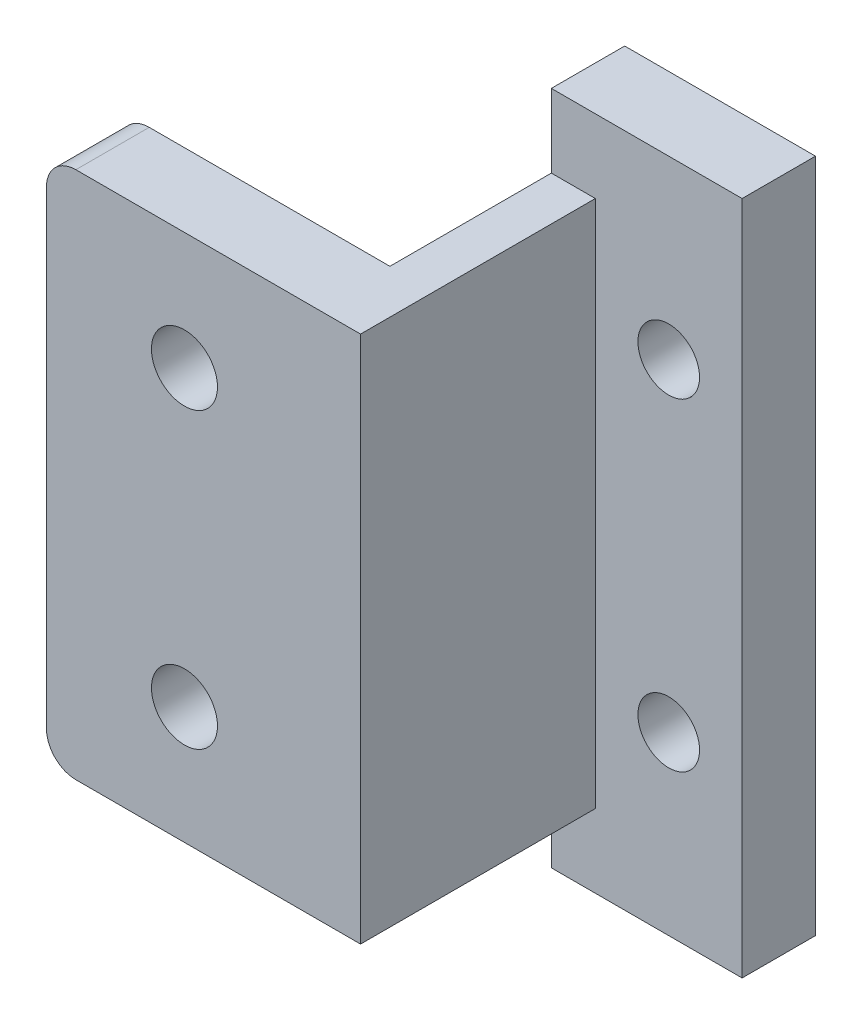
ISO-10303-21;
HEADER;
FILE_DESCRIPTION(('STEP AP214'),'2;1');
FILE_NAME('part.step','',(''),(''),'','','');
FILE_SCHEMA(('AUTOMOTIVE_DESIGN { 1 0 10303 214 1 1 1 1 }'));
ENDSEC;
DATA;
#1=APPLICATION_CONTEXT('core data for automotive mechanical design processes');
#2=APPLICATION_PROTOCOL_DEFINITION('international standard','automotive_design',2000,#1);
#3=PRODUCT_CONTEXT('',#1,'mechanical');
#4=PRODUCT('Part','Part','',(#3));
#5=PRODUCT_RELATED_PRODUCT_CATEGORY('part','',(#4));
#6=PRODUCT_DEFINITION_FORMATION('','',#4);
#7=PRODUCT_DEFINITION_CONTEXT('part definition',#1,'design');
#8=PRODUCT_DEFINITION('design','',#6,#7);
#9=PRODUCT_DEFINITION_SHAPE('','',#8);
#10=(LENGTH_UNIT() NAMED_UNIT(*) SI_UNIT(.MILLI.,.METRE.));
#11=(NAMED_UNIT(*) PLANE_ANGLE_UNIT() SI_UNIT($,.RADIAN.));
#12=(NAMED_UNIT(*) SI_UNIT($,.STERADIAN.) SOLID_ANGLE_UNIT());
#13=UNCERTAINTY_MEASURE_WITH_UNIT(LENGTH_MEASURE(1.E-05),#10,'distance_accuracy_value','');
#14=(GEOMETRIC_REPRESENTATION_CONTEXT(3) GLOBAL_UNCERTAINTY_ASSIGNED_CONTEXT((#13)) GLOBAL_UNIT_ASSIGNED_CONTEXT((#10,
#11,#12)) REPRESENTATION_CONTEXT('',''));
#15=CARTESIAN_POINT('',(0.,0.,0.));
#16=DIRECTION('',(0.,0.,1.));
#17=DIRECTION('',(1.,0.,0.));
#18=AXIS2_PLACEMENT_3D('',#15,#16,#17);
#19=CARTESIAN_POINT('',(0.,0.,-11.));
#20=DIRECTION('',(0.,0.,-1.));
#21=DIRECTION('',(-1.,0.,0.));
#22=AXIS2_PLACEMENT_3D('',#19,#20,#21);
#23=PLANE('',#22);
#24=CARTESIAN_POINT('',(19.0000000000037,29.,-11.));
#25=DIRECTION('',(0.,0.,1.));
#26=DIRECTION('',(1.,0.,0.));
#27=AXIS2_PLACEMENT_3D('',#24,#25,#26);
#28=CIRCLE('',#27,2.1);
#29=CARTESIAN_POINT('',(21.1000000000037,29.,-11.));
#30=VERTEX_POINT('',#29);
#31=EDGE_CURVE('E283',#30,#30,#28,.T.);
#32=ORIENTED_EDGE('',*,*,#31,.F.);
#33=EDGE_LOOP('',(#32));
#34=FACE_BOUND('',#33,.T.);
#35=CARTESIAN_POINT('',(19.0000000000037,7.,-11.));
#36=DIRECTION('',(0.,0.,1.));
#37=DIRECTION('',(1.,0.,0.));
#38=AXIS2_PLACEMENT_3D('',#35,#36,#37);
#39=CIRCLE('',#38,2.1);
#40=CARTESIAN_POINT('',(21.1000000000037,7.,-11.));
#41=VERTEX_POINT('',#40);
#42=EDGE_CURVE('E164',#41,#41,#39,.T.);
#43=ORIENTED_EDGE('',*,*,#42,.F.);
#44=EDGE_LOOP('',(#43));
#45=FACE_BOUND('',#44,.T.);
#46=DIRECTION('',(-1.,0.,0.));
#47=VECTOR('',#46,1.);
#48=CARTESIAN_POINT('',(14.0000000000037,36.,-11.));
#49=LINE('',#48,#47);
#50=CARTESIAN_POINT('',(14.0000000000037,36.,-11.));
#51=VERTEX_POINT('',#50);
#52=CARTESIAN_POINT('',(11.0000000000037,36.,-11.));
#53=VERTEX_POINT('',#52);
#54=EDGE_CURVE('E154',#51,#53,#49,.T.);
#55=ORIENTED_EDGE('',*,*,#54,.F.);
#56=DIRECTION('',(0.,1.,0.));
#57=VECTOR('',#56,1.);
#58=CARTESIAN_POINT('',(14.0000000000037,0.,-11.));
#59=LINE('',#58,#57);
#60=CARTESIAN_POINT('',(14.0000000000037,0.,-11.));
#61=VERTEX_POINT('',#60);
#62=EDGE_CURVE('E181',#61,#51,#59,.T.);
#63=ORIENTED_EDGE('',*,*,#62,.F.);
#64=DIRECTION('',(-1.,0.,0.));
#65=VECTOR('',#64,1.);
#66=CARTESIAN_POINT('',(14.0000000000037,0.,-11.));
#67=LINE('',#66,#65);
#68=CARTESIAN_POINT('',(11.0000000000038,0.,-11.));
#69=VERTEX_POINT('',#68);
#70=EDGE_CURVE('E186',#61,#69,#67,.T.);
#71=ORIENTED_EDGE('',*,*,#70,.T.);
#72=DIRECTION('',(0.,-1.,0.));
#73=VECTOR('',#72,1.);
#74=CARTESIAN_POINT('',(11.0000000000037,41.,-11.));
#75=LINE('',#74,#73);
#76=CARTESIAN_POINT('',(11.0000000000037,-5.,-11.));
#77=VERTEX_POINT('',#76);
#78=EDGE_CURVE('E196',#69,#77,#75,.T.);
#79=ORIENTED_EDGE('',*,*,#78,.T.);
#80=DIRECTION('',(1.,0.,0.));
#81=VECTOR('',#80,1.);
#82=CARTESIAN_POINT('',(24.0000000000037,-5.,-11.));
#83=LINE('',#82,#81);
#84=CARTESIAN_POINT('',(24.0000000000037,-5.,-11.));
#85=VERTEX_POINT('',#84);
#86=EDGE_CURVE('E200',#77,#85,#83,.T.);
#87=ORIENTED_EDGE('',*,*,#86,.T.);
#88=DIRECTION('',(0.,1.,0.));
#89=VECTOR('',#88,1.);
#90=CARTESIAN_POINT('',(24.0000000000037,41.,-11.));
#91=LINE('',#90,#89);
#92=CARTESIAN_POINT('',(24.0000000000037,41.,-11.));
#93=VERTEX_POINT('',#92);
#94=EDGE_CURVE('E190',#85,#93,#91,.T.);
#95=ORIENTED_EDGE('',*,*,#94,.T.);
#96=DIRECTION('',(-1.,0.,0.));
#97=VECTOR('',#96,1.);
#98=CARTESIAN_POINT('',(24.0000000000037,41.,-11.));
#99=LINE('',#98,#97);
#100=CARTESIAN_POINT('',(11.0000000000037,41.,-11.));
#101=VERTEX_POINT('',#100);
#102=EDGE_CURVE('E193',#93,#101,#99,.T.);
#103=ORIENTED_EDGE('',*,*,#102,.T.);
#104=EDGE_CURVE('E197',#101,#53,#75,.T.);
#105=ORIENTED_EDGE('',*,*,#104,.T.);
#106=EDGE_LOOP('',(#55,#63,#71,#79,#87,#95,#103,#105));
#107=FACE_BOUND('',#106,.T.);
#108=ADVANCED_FACE('F36',(#34,#45,#107),#23,.F.);
#109=CARTESIAN_POINT('',(6.99999999999803,3.,5.));
#110=DIRECTION('',(0.,0.,1.));
#111=DIRECTION('',(1.,0.,0.));
#112=AXIS2_PLACEMENT_3D('',#109,#110,#111);
#113=PLANE('',#112);
#114=DIRECTION('',(0.,-1.,0.));
#115=VECTOR('',#114,1.);
#116=CARTESIAN_POINT('',(-7.40000000000161,36.,5.));
#117=LINE('',#116,#115);
#118=CARTESIAN_POINT('',(-7.40000000000161,34.,5.));
#119=VERTEX_POINT('',#118);
#120=CARTESIAN_POINT('',(-7.40000000000161,2.,5.));
#121=VERTEX_POINT('',#120);
#122=EDGE_CURVE('E252',#119,#121,#117,.T.);
#123=ORIENTED_EDGE('',*,*,#122,.T.);
#124=CARTESIAN_POINT('',(-5.40000000000161,2.,5.));
#125=DIRECTION('',(0.,0.,1.));
#126=DIRECTION('',(1.,0.,0.));
#127=AXIS2_PLACEMENT_3D('',#124,#125,#126);
#128=CIRCLE('',#127,2.);
#129=CARTESIAN_POINT('',(-5.40000000000161,0.,5.));
#130=VERTEX_POINT('',#129);
#131=EDGE_CURVE('E46',#121,#130,#128,.T.);
#132=ORIENTED_EDGE('',*,*,#131,.T.);
#133=DIRECTION('',(1.,0.,0.));
#134=VECTOR('',#133,1.);
#135=CARTESIAN_POINT('',(-7.40000000000161,0.,5.));
#136=LINE('',#135,#134);
#137=CARTESIAN_POINT('',(14.0000000000037,0.,5.));
#138=VERTEX_POINT('',#137);
#139=EDGE_CURVE('E256',#130,#138,#136,.T.);
#140=ORIENTED_EDGE('',*,*,#139,.T.);
#141=DIRECTION('',(0.,-1.,0.));
#142=VECTOR('',#141,1.);
#143=CARTESIAN_POINT('',(14.0000000000037,36.,5.));
#144=LINE('',#143,#142);
#145=CARTESIAN_POINT('',(14.0000000000037,36.,5.));
#146=VERTEX_POINT('',#145);
#147=EDGE_CURVE('E173',#146,#138,#144,.T.);
#148=ORIENTED_EDGE('',*,*,#147,.F.);
#149=DIRECTION('',(-1.,0.,0.));
#150=VECTOR('',#149,1.);
#151=CARTESIAN_POINT('',(6.99999999999803,36.,5.));
#152=LINE('',#151,#150);
#153=CARTESIAN_POINT('',(-5.40000000000161,36.,5.));
#154=VERTEX_POINT('',#153);
#155=EDGE_CURVE('E249',#146,#154,#152,.T.);
#156=ORIENTED_EDGE('',*,*,#155,.T.);
#157=CARTESIAN_POINT('',(-5.40000000000161,34.,5.));
#158=DIRECTION('',(0.,0.,1.));
#159=DIRECTION('',(1.,0.,0.));
#160=AXIS2_PLACEMENT_3D('',#157,#158,#159);
#161=CIRCLE('',#160,2.);
#162=EDGE_CURVE('E277',#154,#119,#161,.T.);
#163=ORIENTED_EDGE('',*,*,#162,.T.);
#164=EDGE_LOOP('',(#123,#132,#140,#148,#156,#163));
#165=FACE_BOUND('',#164,.T.);
#166=CARTESIAN_POINT('',(1.99999999999802,8.,5.));
#167=DIRECTION('',(0.,0.,1.));
#168=DIRECTION('',(1.,0.,0.));
#169=AXIS2_PLACEMENT_3D('',#166,#167,#168);
#170=CIRCLE('',#169,2.25);
#171=CARTESIAN_POINT('',(4.24999999999802,8.,5.));
#172=VERTEX_POINT('',#171);
#173=EDGE_CURVE('E139',#172,#172,#170,.T.);
#174=ORIENTED_EDGE('',*,*,#173,.F.);
#175=EDGE_LOOP('',(#174));
#176=FACE_BOUND('',#175,.T.);
#177=CARTESIAN_POINT('',(1.99999999999802,28.,5.));
#178=DIRECTION('',(0.,0.,1.));
#179=DIRECTION('',(1.,0.,0.));
#180=AXIS2_PLACEMENT_3D('',#177,#178,#179);
#181=CIRCLE('',#180,2.25000000000001);
#182=CARTESIAN_POINT('',(4.24999999999803,28.,5.));
#183=VERTEX_POINT('',#182);
#184=EDGE_CURVE('E235',#183,#183,#181,.T.);
#185=ORIENTED_EDGE('',*,*,#184,.F.);
#186=EDGE_LOOP('',(#185));
#187=FACE_BOUND('',#186,.T.);
#188=ADVANCED_FACE('F299',(#165,#176,#187),#113,.T.);
#189=CARTESIAN_POINT('',(6.99999999999803,3.,0.));
#190=DIRECTION('',(0.,0.,1.));
#191=DIRECTION('',(1.,0.,0.));
#192=AXIS2_PLACEMENT_3D('',#189,#190,#191);
#193=PLANE('',#192);
#194=DIRECTION('',(1.,0.,0.));
#195=VECTOR('',#194,1.);
#196=CARTESIAN_POINT('',(-7.40000000000161,0.,0.));
#197=LINE('',#196,#195);
#198=CARTESIAN_POINT('',(-5.40000000000161,0.,0.));
#199=VERTEX_POINT('',#198);
#200=CARTESIAN_POINT('',(11.0000000000038,0.,0.));
#201=VERTEX_POINT('',#200);
#202=EDGE_CURVE('E253',#199,#201,#197,.T.);
#203=ORIENTED_EDGE('',*,*,#202,.F.);
#204=CARTESIAN_POINT('',(-5.40000000000161,2.,0.));
#205=DIRECTION('',(0.,0.,1.));
#206=DIRECTION('',(1.,0.,0.));
#207=AXIS2_PLACEMENT_3D('',#204,#205,#206);
#208=CIRCLE('',#207,2.);
#209=CARTESIAN_POINT('',(-7.40000000000161,2.,0.));
#210=VERTEX_POINT('',#209);
#211=EDGE_CURVE('E269',#199,#210,#208,.F.);
#212=ORIENTED_EDGE('',*,*,#211,.T.);
#213=DIRECTION('',(0.,-1.,0.));
#214=VECTOR('',#213,1.);
#215=CARTESIAN_POINT('',(-7.40000000000161,36.,0.));
#216=LINE('',#215,#214);
#217=CARTESIAN_POINT('',(-7.40000000000161,34.,0.));
#218=VERTEX_POINT('',#217);
#219=EDGE_CURVE('E138',#218,#210,#216,.T.);
#220=ORIENTED_EDGE('',*,*,#219,.F.);
#221=CARTESIAN_POINT('',(-5.40000000000161,34.,0.));
#222=DIRECTION('',(0.,0.,1.));
#223=DIRECTION('',(1.,0.,0.));
#224=AXIS2_PLACEMENT_3D('',#221,#222,#223);
#225=CIRCLE('',#224,2.);
#226=CARTESIAN_POINT('',(-5.40000000000161,36.,0.));
#227=VERTEX_POINT('',#226);
#228=EDGE_CURVE('E135',#218,#227,#225,.F.);
#229=ORIENTED_EDGE('',*,*,#228,.T.);
#230=DIRECTION('',(-1.,0.,0.));
#231=VECTOR('',#230,1.);
#232=CARTESIAN_POINT('',(6.99999999999803,36.,0.));
#233=LINE('',#232,#231);
#234=CARTESIAN_POINT('',(11.0000000000038,36.,0.));
#235=VERTEX_POINT('',#234);
#236=EDGE_CURVE('E128',#235,#227,#233,.T.);
#237=ORIENTED_EDGE('',*,*,#236,.F.);
#238=DIRECTION('',(0.,1.,0.));
#239=VECTOR('',#238,1.);
#240=CARTESIAN_POINT('',(11.0000000000038,-7.00000000000001,0.));
#241=LINE('',#240,#239);
#242=EDGE_CURVE('E133',#201,#235,#241,.T.);
#243=ORIENTED_EDGE('',*,*,#242,.F.);
#244=EDGE_LOOP('',(#203,#212,#220,#229,#237,#243));
#245=FACE_BOUND('',#244,.T.);
#246=CARTESIAN_POINT('',(1.99999999999802,8.,0.));
#247=DIRECTION('',(0.,0.,1.));
#248=DIRECTION('',(1.,0.,0.));
#249=AXIS2_PLACEMENT_3D('',#246,#247,#248);
#250=CIRCLE('',#249,2.25);
#251=CARTESIAN_POINT('',(4.24999999999802,8.,0.));
#252=VERTEX_POINT('',#251);
#253=EDGE_CURVE('E239',#252,#252,#250,.T.);
#254=ORIENTED_EDGE('',*,*,#253,.T.);
#255=EDGE_LOOP('',(#254));
#256=FACE_BOUND('',#255,.T.);
#257=CARTESIAN_POINT('',(1.99999999999802,28.,0.));
#258=DIRECTION('',(0.,0.,1.));
#259=DIRECTION('',(1.,0.,0.));
#260=AXIS2_PLACEMENT_3D('',#257,#258,#259);
#261=CIRCLE('',#260,2.25000000000001);
#262=CARTESIAN_POINT('',(4.24999999999803,28.,0.));
#263=VERTEX_POINT('',#262);
#264=EDGE_CURVE('E225',#263,#263,#261,.T.);
#265=ORIENTED_EDGE('',*,*,#264,.T.);
#266=EDGE_LOOP('',(#265));
#267=FACE_BOUND('',#266,.T.);
#268=ADVANCED_FACE('F131',(#245,#256,#267),#193,.F.);
#269=CARTESIAN_POINT('',(6.99999999999803,36.,5.));
#270=DIRECTION('',(0.,-1.,0.));
#271=DIRECTION('',(0.,0.,-1.));
#272=AXIS2_PLACEMENT_3D('',#269,#270,#271);
#273=PLANE('',#272);
#274=ORIENTED_EDGE('',*,*,#236,.T.);
#275=DIRECTION('',(0.,0.,-1.));
#276=VECTOR('',#275,1.);
#277=CARTESIAN_POINT('',(-5.40000000000161,36.,5.));
#278=LINE('',#277,#276);
#279=EDGE_CURVE('E11',#227,#154,#278,.F.);
#280=ORIENTED_EDGE('',*,*,#279,.T.);
#281=ORIENTED_EDGE('',*,*,#155,.F.);
#282=DIRECTION('',(0.,0.,1.));
#283=VECTOR('',#282,1.);
#284=CARTESIAN_POINT('',(14.0000000000037,36.,-11.));
#285=LINE('',#284,#283);
#286=EDGE_CURVE('E169',#51,#146,#285,.T.);
#287=ORIENTED_EDGE('',*,*,#286,.F.);
#288=ORIENTED_EDGE('',*,*,#54,.T.);
#289=DIRECTION('',(0.,0.,-1.));
#290=VECTOR('',#289,1.);
#291=CARTESIAN_POINT('',(11.0000000000038,36.,-16.0000000000004));
#292=LINE('',#291,#290);
#293=EDGE_CURVE('E146',#235,#53,#292,.T.);
#294=ORIENTED_EDGE('',*,*,#293,.F.);
#295=EDGE_LOOP('',(#274,#280,#281,#287,#288,#294));
#296=FACE_BOUND('',#295,.T.);
#297=ADVANCED_FACE('F151',(#296),#273,.F.);
#298=CARTESIAN_POINT('',(-7.40000000000161,36.,5.));
#299=DIRECTION('',(1.,0.,0.));
#300=DIRECTION('',(0.,1.,0.));
#301=AXIS2_PLACEMENT_3D('',#298,#299,#300);
#302=PLANE('',#301);
#303=ORIENTED_EDGE('',*,*,#219,.T.);
#304=DIRECTION('',(0.,0.,-1.));
#305=VECTOR('',#304,1.);
#306=CARTESIAN_POINT('',(-7.40000000000161,2.,5.));
#307=LINE('',#306,#305);
#308=EDGE_CURVE('E60',#210,#121,#307,.F.);
#309=ORIENTED_EDGE('',*,*,#308,.T.);
#310=ORIENTED_EDGE('',*,*,#122,.F.);
#311=DIRECTION('',(0.,0.,-1.));
#312=VECTOR('',#311,1.);
#313=CARTESIAN_POINT('',(-7.40000000000161,34.,5.));
#314=LINE('',#313,#312);
#315=EDGE_CURVE('E272',#119,#218,#314,.T.);
#316=ORIENTED_EDGE('',*,*,#315,.T.);
#317=EDGE_LOOP('',(#303,#309,#310,#316));
#318=FACE_BOUND('',#317,.T.);
#319=ADVANCED_FACE('F349',(#318),#302,.F.);
#320=CARTESIAN_POINT('',(-7.40000000000161,0.,5.));
#321=DIRECTION('',(0.,1.,0.));
#322=DIRECTION('',(-1.,0.,0.));
#323=AXIS2_PLACEMENT_3D('',#320,#321,#322);
#324=PLANE('',#323);
#325=ORIENTED_EDGE('',*,*,#139,.F.);
#326=DIRECTION('',(0.,0.,-1.));
#327=VECTOR('',#326,1.);
#328=CARTESIAN_POINT('',(-5.40000000000161,0.,5.));
#329=LINE('',#328,#327);
#330=EDGE_CURVE('E258',#130,#199,#329,.T.);
#331=ORIENTED_EDGE('',*,*,#330,.T.);
#332=ORIENTED_EDGE('',*,*,#202,.T.);
#333=DIRECTION('',(0.,0.,-1.));
#334=VECTOR('',#333,1.);
#335=CARTESIAN_POINT('',(11.0000000000038,0.,5.));
#336=LINE('',#335,#334);
#337=EDGE_CURVE('E148',#201,#69,#336,.T.);
#338=ORIENTED_EDGE('',*,*,#337,.T.);
#339=ORIENTED_EDGE('',*,*,#70,.F.);
#340=DIRECTION('',(0.,0.,-1.));
#341=VECTOR('',#340,1.);
#342=CARTESIAN_POINT('',(14.0000000000037,0.,5.));
#343=LINE('',#342,#341);
#344=EDGE_CURVE('E177',#138,#61,#343,.T.);
#345=ORIENTED_EDGE('',*,*,#344,.F.);
#346=EDGE_LOOP('',(#325,#331,#332,#338,#339,#345));
#347=FACE_BOUND('',#346,.T.);
#348=ADVANCED_FACE('F340',(#347),#324,.F.);
#349=CARTESIAN_POINT('',(1.99999999999802,8.,5.));
#350=DIRECTION('',(0.,0.,-1.));
#351=DIRECTION('',(-1.,0.,0.));
#352=AXIS2_PLACEMENT_3D('',#349,#350,#351);
#353=CYLINDRICAL_SURFACE('',#352,2.25);
#354=ORIENTED_EDGE('',*,*,#173,.T.);
#355=EDGE_LOOP('',(#354));
#356=FACE_BOUND('',#355,.T.);
#357=ORIENTED_EDGE('',*,*,#253,.F.);
#358=EDGE_LOOP('',(#357));
#359=FACE_BOUND('',#358,.T.);
#360=ADVANCED_FACE('F336',(#356,#359),#353,.F.);
#361=CARTESIAN_POINT('',(1.99999999999802,28.,5.));
#362=DIRECTION('',(0.,0.,-1.));
#363=DIRECTION('',(-1.,0.,0.));
#364=AXIS2_PLACEMENT_3D('',#361,#362,#363);
#365=CYLINDRICAL_SURFACE('',#364,2.25000000000001);
#366=ORIENTED_EDGE('',*,*,#184,.T.);
#367=EDGE_LOOP('',(#366));
#368=FACE_BOUND('',#367,.T.);
#369=ORIENTED_EDGE('',*,*,#264,.F.);
#370=EDGE_LOOP('',(#369));
#371=FACE_BOUND('',#370,.T.);
#372=ADVANCED_FACE('F332',(#368,#371),#365,.F.);
#373=CARTESIAN_POINT('',(-11.9999999999965,136.100000000002,-16.0000000000004));
#374=DIRECTION('',(0.,0.,-1.));
#375=DIRECTION('',(0.,1.,0.));
#376=AXIS2_PLACEMENT_3D('',#373,#374,#375);
#377=PLANE('',#376);
#378=CARTESIAN_POINT('',(19.0000000000037,29.,-16.0000000000004));
#379=DIRECTION('',(0.,0.,-1.));
#380=DIRECTION('',(0.,1.,0.));
#381=AXIS2_PLACEMENT_3D('',#378,#379,#380);
#382=CIRCLE('',#381,2.1);
#383=CARTESIAN_POINT('',(19.0000000000037,31.1,-16.0000000000004));
#384=VERTEX_POINT('',#383);
#385=EDGE_CURVE('E40',#384,#384,#382,.T.);
#386=ORIENTED_EDGE('',*,*,#385,.F.);
#387=EDGE_LOOP('',(#386));
#388=FACE_BOUND('',#387,.T.);
#389=CARTESIAN_POINT('',(19.0000000000037,7.,-16.0000000000004));
#390=DIRECTION('',(0.,0.,-1.));
#391=DIRECTION('',(0.,1.,0.));
#392=AXIS2_PLACEMENT_3D('',#389,#390,#391);
#393=CIRCLE('',#392,2.1);
#394=CARTESIAN_POINT('',(19.0000000000037,9.1,-16.0000000000004));
#395=VERTEX_POINT('',#394);
#396=EDGE_CURVE('E162',#395,#395,#393,.T.);
#397=ORIENTED_EDGE('',*,*,#396,.F.);
#398=EDGE_LOOP('',(#397));
#399=FACE_BOUND('',#398,.T.);
#400=DIRECTION('',(0.,-1.,0.));
#401=VECTOR('',#400,1.);
#402=CARTESIAN_POINT('',(11.0000000000037,-5.00000000000001,-16.0000000000004));
#403=LINE('',#402,#401);
#404=CARTESIAN_POINT('',(11.0000000000037,41.,-16.0000000000004));
#405=VERTEX_POINT('',#404);
#406=CARTESIAN_POINT('',(11.0000000000037,-5.,-16.0000000000004));
#407=VERTEX_POINT('',#406);
#408=EDGE_CURVE('E202',#405,#407,#403,.T.);
#409=ORIENTED_EDGE('',*,*,#408,.F.);
#410=DIRECTION('',(-1.,0.,0.));
#411=VECTOR('',#410,1.);
#412=CARTESIAN_POINT('',(11.0000000000037,41.,-16.0000000000004));
#413=LINE('',#412,#411);
#414=CARTESIAN_POINT('',(24.0000000000037,41.,-16.0000000000004));
#415=VERTEX_POINT('',#414);
#416=EDGE_CURVE('E203',#415,#405,#413,.T.);
#417=ORIENTED_EDGE('',*,*,#416,.F.);
#418=DIRECTION('',(0.,1.,0.));
#419=VECTOR('',#418,1.);
#420=CARTESIAN_POINT('',(24.0000000000037,41.,-16.0000000000004));
#421=LINE('',#420,#419);
#422=CARTESIAN_POINT('',(24.0000000000037,-5.,-16.0000000000004));
#423=VERTEX_POINT('',#422);
#424=EDGE_CURVE('E209',#423,#415,#421,.T.);
#425=ORIENTED_EDGE('',*,*,#424,.F.);
#426=DIRECTION('',(1.,0.,0.));
#427=VECTOR('',#426,1.);
#428=CARTESIAN_POINT('',(24.0000000000037,-5.,-16.0000000000004));
#429=LINE('',#428,#427);
#430=EDGE_CURVE('E214',#407,#423,#429,.T.);
#431=ORIENTED_EDGE('',*,*,#430,.F.);
#432=EDGE_LOOP('',(#409,#417,#425,#431));
#433=FACE_BOUND('',#432,.T.);
#434=ADVANCED_FACE('F309',(#388,#399,#433),#377,.T.);
#435=CARTESIAN_POINT('',(11.0000000000037,-5.,-65.0407993409593));
#436=DIRECTION('',(-1.,0.,0.));
#437=DIRECTION('',(0.,-1.,0.));
#438=AXIS2_PLACEMENT_3D('',#435,#436,#437);
#439=PLANE('',#438);
#440=ORIENTED_EDGE('',*,*,#78,.F.);
#441=ORIENTED_EDGE('',*,*,#337,.F.);
#442=ORIENTED_EDGE('',*,*,#242,.T.);
#443=ORIENTED_EDGE('',*,*,#293,.T.);
#444=ORIENTED_EDGE('',*,*,#104,.F.);
#445=DIRECTION('',(0.,0.,1.));
#446=VECTOR('',#445,1.);
#447=CARTESIAN_POINT('',(11.0000000000037,41.,-65.0407993409593));
#448=LINE('',#447,#446);
#449=EDGE_CURVE('E207',#405,#101,#448,.T.);
#450=ORIENTED_EDGE('',*,*,#449,.F.);
#451=ORIENTED_EDGE('',*,*,#408,.T.);
#452=DIRECTION('',(0.,0.,1.));
#453=VECTOR('',#452,1.);
#454=CARTESIAN_POINT('',(11.0000000000037,-5.,-65.0407993409593));
#455=LINE('',#454,#453);
#456=EDGE_CURVE('E218',#407,#77,#455,.T.);
#457=ORIENTED_EDGE('',*,*,#456,.T.);
#458=EDGE_LOOP('',(#440,#441,#442,#443,#444,#450,#451,#457));
#459=FACE_BOUND('',#458,.T.);
#460=ADVANCED_FACE('F144',(#459),#439,.T.);
#461=CARTESIAN_POINT('',(24.0000000000037,-5.,-65.0407993409593));
#462=DIRECTION('',(0.,-1.,0.));
#463=DIRECTION('',(1.,0.,0.));
#464=AXIS2_PLACEMENT_3D('',#461,#462,#463);
#465=PLANE('',#464);
#466=ORIENTED_EDGE('',*,*,#86,.F.);
#467=ORIENTED_EDGE('',*,*,#456,.F.);
#468=ORIENTED_EDGE('',*,*,#430,.T.);
#469=DIRECTION('',(0.,0.,1.));
#470=VECTOR('',#469,1.);
#471=CARTESIAN_POINT('',(24.0000000000037,-5.,-65.0407993409593));
#472=LINE('',#471,#470);
#473=EDGE_CURVE('E213',#423,#85,#472,.T.);
#474=ORIENTED_EDGE('',*,*,#473,.T.);
#475=EDGE_LOOP('',(#466,#467,#468,#474));
#476=FACE_BOUND('',#475,.T.);
#477=ADVANCED_FACE('F314',(#476),#465,.T.);
#478=CARTESIAN_POINT('',(24.0000000000037,41.,-65.0407993409593));
#479=DIRECTION('',(1.,0.,0.));
#480=DIRECTION('',(0.,1.,0.));
#481=AXIS2_PLACEMENT_3D('',#478,#479,#480);
#482=PLANE('',#481);
#483=ORIENTED_EDGE('',*,*,#94,.F.);
#484=ORIENTED_EDGE('',*,*,#473,.F.);
#485=ORIENTED_EDGE('',*,*,#424,.T.);
#486=DIRECTION('',(0.,0.,1.));
#487=VECTOR('',#486,1.);
#488=CARTESIAN_POINT('',(24.0000000000037,41.,-65.0407993409593));
#489=LINE('',#488,#487);
#490=EDGE_CURVE('E208',#415,#93,#489,.T.);
#491=ORIENTED_EDGE('',*,*,#490,.T.);
#492=EDGE_LOOP('',(#483,#484,#485,#491));
#493=FACE_BOUND('',#492,.T.);
#494=ADVANCED_FACE('F317',(#493),#482,.T.);
#495=CARTESIAN_POINT('',(11.0000000000037,41.,-65.0407993409593));
#496=DIRECTION('',(0.,1.,0.));
#497=DIRECTION('',(0.,0.,1.));
#498=AXIS2_PLACEMENT_3D('',#495,#496,#497);
#499=PLANE('',#498);
#500=ORIENTED_EDGE('',*,*,#102,.F.);
#501=ORIENTED_EDGE('',*,*,#490,.F.);
#502=ORIENTED_EDGE('',*,*,#416,.T.);
#503=ORIENTED_EDGE('',*,*,#449,.T.);
#504=EDGE_LOOP('',(#500,#501,#502,#503));
#505=FACE_BOUND('',#504,.T.);
#506=ADVANCED_FACE('F306',(#505),#499,.T.);
#507=CARTESIAN_POINT('',(14.0000000000037,0.,0.));
#508=DIRECTION('',(1.,0.,0.));
#509=DIRECTION('',(0.,0.,-1.));
#510=AXIS2_PLACEMENT_3D('',#507,#508,#509);
#511=PLANE('',#510);
#512=ORIENTED_EDGE('',*,*,#286,.T.);
#513=ORIENTED_EDGE('',*,*,#147,.T.);
#514=ORIENTED_EDGE('',*,*,#344,.T.);
#515=ORIENTED_EDGE('',*,*,#62,.T.);
#516=EDGE_LOOP('',(#512,#513,#514,#515));
#517=FACE_BOUND('',#516,.T.);
#518=ADVANCED_FACE('F324',(#517),#511,.T.);
#519=CARTESIAN_POINT('',(-5.40000000000161,2.,5.));
#520=DIRECTION('',(0.,0.,-1.));
#521=DIRECTION('',(-1.,0.,0.));
#522=AXIS2_PLACEMENT_3D('',#519,#520,#521);
#523=CYLINDRICAL_SURFACE('',#522,2.);
#524=ORIENTED_EDGE('',*,*,#131,.F.);
#525=ORIENTED_EDGE('',*,*,#308,.F.);
#526=ORIENTED_EDGE('',*,*,#211,.F.);
#527=ORIENTED_EDGE('',*,*,#330,.F.);
#528=EDGE_LOOP('',(#524,#525,#526,#527));
#529=FACE_BOUND('',#528,.T.);
#530=ADVANCED_FACE('F354',(#529),#523,.T.);
#531=CARTESIAN_POINT('',(-5.40000000000161,34.,5.));
#532=DIRECTION('',(0.,0.,-1.));
#533=DIRECTION('',(-1.,0.,0.));
#534=AXIS2_PLACEMENT_3D('',#531,#532,#533);
#535=CYLINDRICAL_SURFACE('',#534,2.);
#536=ORIENTED_EDGE('',*,*,#162,.F.);
#537=ORIENTED_EDGE('',*,*,#279,.F.);
#538=ORIENTED_EDGE('',*,*,#228,.F.);
#539=ORIENTED_EDGE('',*,*,#315,.F.);
#540=EDGE_LOOP('',(#536,#537,#538,#539));
#541=FACE_BOUND('',#540,.T.);
#542=ADVANCED_FACE('F38',(#541),#535,.T.);
#543=CARTESIAN_POINT('',(19.0000000000037,7.,-54.));
#544=DIRECTION('',(0.,0.,1.));
#545=DIRECTION('',(1.,0.,0.));
#546=AXIS2_PLACEMENT_3D('',#543,#544,#545);
#547=CYLINDRICAL_SURFACE('',#546,2.1);
#548=ORIENTED_EDGE('',*,*,#396,.T.);
#549=EDGE_LOOP('',(#548));
#550=FACE_BOUND('',#549,.T.);
#551=ORIENTED_EDGE('',*,*,#42,.T.);
#552=EDGE_LOOP('',(#551));
#553=FACE_BOUND('',#552,.T.);
#554=ADVANCED_FACE('F295',(#550,#553),#547,.F.);
#555=CARTESIAN_POINT('',(19.0000000000037,29.,-54.));
#556=DIRECTION('',(0.,0.,1.));
#557=DIRECTION('',(1.,0.,0.));
#558=AXIS2_PLACEMENT_3D('',#555,#556,#557);
#559=CYLINDRICAL_SURFACE('',#558,2.1);
#560=ORIENTED_EDGE('',*,*,#385,.T.);
#561=EDGE_LOOP('',(#560));
#562=FACE_BOUND('',#561,.T.);
#563=ORIENTED_EDGE('',*,*,#31,.T.);
#564=EDGE_LOOP('',(#563));
#565=FACE_BOUND('',#564,.T.);
#566=ADVANCED_FACE('F385',(#562,#565),#559,.F.);
#567=CLOSED_SHELL('',(#108,#188,#268,#297,#319,#348,#360,#372,#434,#460,#477,#494,#506,#518,
#530,#542,#554,#566));
#568=MANIFOLD_SOLID_BREP('B2',#567);
#569=ADVANCED_BREP_SHAPE_REPRESENTATION('',(#18,#568),#14);
#570=SHAPE_DEFINITION_REPRESENTATION(#9,#569);
ENDSEC;
END-ISO-10303-21;
